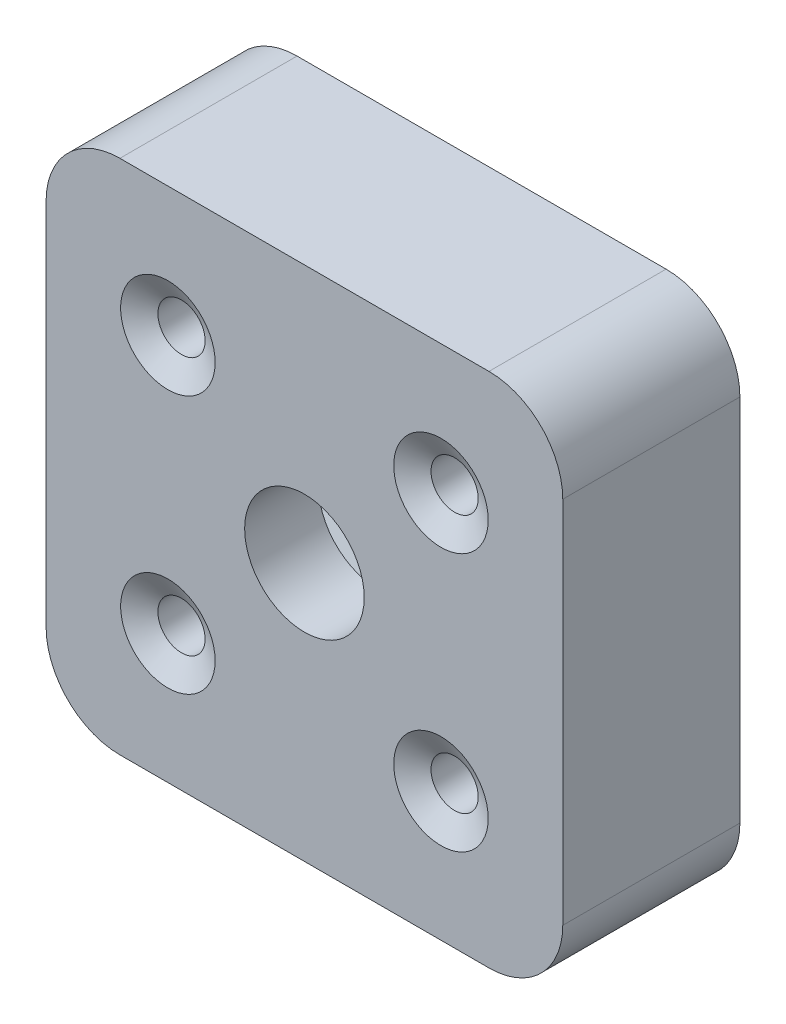
ISO-10303-21;
HEADER;
FILE_DESCRIPTION(('STEP AP214'),'2;1');
FILE_NAME('part.step','',(''),(''),'','','');
FILE_SCHEMA(('AUTOMOTIVE_DESIGN { 1 0 10303 214 1 1 1 1 }'));
ENDSEC;
DATA;
#1=APPLICATION_CONTEXT('core data for automotive mechanical design processes');
#2=APPLICATION_PROTOCOL_DEFINITION('international standard','automotive_design',2000,#1);
#3=PRODUCT_CONTEXT('',#1,'mechanical');
#4=PRODUCT('Part','Part','',(#3));
#5=PRODUCT_RELATED_PRODUCT_CATEGORY('part','',(#4));
#6=PRODUCT_DEFINITION_FORMATION('','',#4);
#7=PRODUCT_DEFINITION_CONTEXT('part definition',#1,'design');
#8=PRODUCT_DEFINITION('design','',#6,#7);
#9=PRODUCT_DEFINITION_SHAPE('','',#8);
#10=(LENGTH_UNIT() NAMED_UNIT(*) SI_UNIT(.MILLI.,.METRE.));
#11=(NAMED_UNIT(*) PLANE_ANGLE_UNIT() SI_UNIT($,.RADIAN.));
#12=(NAMED_UNIT(*) SI_UNIT($,.STERADIAN.) SOLID_ANGLE_UNIT());
#13=UNCERTAINTY_MEASURE_WITH_UNIT(LENGTH_MEASURE(1.E-05),#10,'distance_accuracy_value','');
#14=(GEOMETRIC_REPRESENTATION_CONTEXT(3) GLOBAL_UNCERTAINTY_ASSIGNED_CONTEXT((#13)) GLOBAL_UNIT_ASSIGNED_CONTEXT((#10,
#11,#12)) REPRESENTATION_CONTEXT('',''));
#15=CARTESIAN_POINT('',(0.,0.,0.));
#16=DIRECTION('',(0.,0.,1.));
#17=DIRECTION('',(1.,0.,0.));
#18=AXIS2_PLACEMENT_3D('',#15,#16,#17);
#19=CARTESIAN_POINT('',(0.,0.,12.));
#20=DIRECTION('',(0.,0.,-1.));
#21=DIRECTION('',(-1.,0.,0.));
#22=AXIS2_PLACEMENT_3D('',#19,#20,#21);
#23=CYLINDRICAL_SURFACE('',#22,4.05);
#24=CARTESIAN_POINT('',(0.,0.,12.));
#25=DIRECTION('',(0.,0.,1.));
#26=DIRECTION('',(1.,0.,0.));
#27=AXIS2_PLACEMENT_3D('',#24,#25,#26);
#28=CIRCLE('',#27,4.05);
#29=CARTESIAN_POINT('',(4.05,0.,12.));
#30=VERTEX_POINT('',#29);
#31=EDGE_CURVE('E233',#30,#30,#28,.T.);
#32=ORIENTED_EDGE('',*,*,#31,.T.);
#33=EDGE_LOOP('',(#32));
#34=FACE_BOUND('',#33,.T.);
#35=CARTESIAN_POINT('',(0.,0.,7.));
#36=DIRECTION('',(0.,0.,-1.));
#37=DIRECTION('',(-1.,0.,0.));
#38=AXIS2_PLACEMENT_3D('',#35,#36,#37);
#39=CIRCLE('',#38,4.05);
#40=CARTESIAN_POINT('',(-4.05,0.,7.));
#41=VERTEX_POINT('',#40);
#42=EDGE_CURVE('E43',#41,#41,#39,.T.);
#43=ORIENTED_EDGE('',*,*,#42,.T.);
#44=EDGE_LOOP('',(#43));
#45=FACE_BOUND('',#44,.T.);
#46=ADVANCED_FACE('F39',(#34,#45),#23,.F.);
#47=CARTESIAN_POINT('',(0.,-17.5,12.));
#48=DIRECTION('',(0.,1.,0.));
#49=DIRECTION('',(0.,0.,1.));
#50=AXIS2_PLACEMENT_3D('',#47,#48,#49);
#51=PLANE('',#50);
#52=DIRECTION('',(1.,0.,0.));
#53=VECTOR('',#52,1.);
#54=CARTESIAN_POINT('',(0.,-17.5,0.));
#55=LINE('',#54,#53);
#56=CARTESIAN_POINT('',(-12.5,-17.5,0.));
#57=VERTEX_POINT('',#56);
#58=CARTESIAN_POINT('',(12.5,-17.5,0.));
#59=VERTEX_POINT('',#58);
#60=EDGE_CURVE('E248',#57,#59,#55,.T.);
#61=ORIENTED_EDGE('',*,*,#60,.T.);
#62=DIRECTION('',(0.,0.,-1.));
#63=VECTOR('',#62,1.);
#64=CARTESIAN_POINT('',(12.5,-17.5,12.));
#65=LINE('',#64,#63);
#66=CARTESIAN_POINT('',(12.5,-17.5,12.));
#67=VERTEX_POINT('',#66);
#68=EDGE_CURVE('E274',#59,#67,#65,.F.);
#69=ORIENTED_EDGE('',*,*,#68,.T.);
#70=DIRECTION('',(1.,0.,0.));
#71=VECTOR('',#70,1.);
#72=CARTESIAN_POINT('',(0.,-17.5,12.));
#73=LINE('',#72,#71);
#74=CARTESIAN_POINT('',(-12.5,-17.5,12.));
#75=VERTEX_POINT('',#74);
#76=EDGE_CURVE('E221',#75,#67,#73,.T.);
#77=ORIENTED_EDGE('',*,*,#76,.F.);
#78=DIRECTION('',(0.,0.,-1.));
#79=VECTOR('',#78,1.);
#80=CARTESIAN_POINT('',(-12.5,-17.5,0.));
#81=LINE('',#80,#79);
#82=EDGE_CURVE('E271',#75,#57,#81,.T.);
#83=ORIENTED_EDGE('',*,*,#82,.T.);
#84=EDGE_LOOP('',(#61,#69,#77,#83));
#85=FACE_BOUND('',#84,.T.);
#86=ADVANCED_FACE('F315',(#85),#51,.F.);
#87=CARTESIAN_POINT('',(17.5,0.,12.));
#88=DIRECTION('',(-1.,0.,0.));
#89=DIRECTION('',(0.,0.,1.));
#90=AXIS2_PLACEMENT_3D('',#87,#88,#89);
#91=PLANE('',#90);
#92=DIRECTION('',(0.,1.,0.));
#93=VECTOR('',#92,1.);
#94=CARTESIAN_POINT('',(17.5,0.,12.));
#95=LINE('',#94,#93);
#96=CARTESIAN_POINT('',(17.5,-12.5,12.));
#97=VERTEX_POINT('',#96);
#98=CARTESIAN_POINT('',(17.5,12.5,12.));
#99=VERTEX_POINT('',#98);
#100=EDGE_CURVE('E224',#97,#99,#95,.T.);
#101=ORIENTED_EDGE('',*,*,#100,.F.);
#102=DIRECTION('',(0.,0.,-1.));
#103=VECTOR('',#102,1.);
#104=CARTESIAN_POINT('',(17.5,-12.5,12.));
#105=LINE('',#104,#103);
#106=CARTESIAN_POINT('',(17.5,-12.5,0.));
#107=VERTEX_POINT('',#106);
#108=EDGE_CURVE('E260',#97,#107,#105,.T.);
#109=ORIENTED_EDGE('',*,*,#108,.T.);
#110=DIRECTION('',(0.,1.,0.));
#111=VECTOR('',#110,1.);
#112=CARTESIAN_POINT('',(17.5,0.,0.));
#113=LINE('',#112,#111);
#114=CARTESIAN_POINT('',(17.5,12.5,0.));
#115=VERTEX_POINT('',#114);
#116=EDGE_CURVE('E251',#107,#115,#113,.T.);
#117=ORIENTED_EDGE('',*,*,#116,.T.);
#118=DIRECTION('',(0.,0.,-1.));
#119=VECTOR('',#118,1.);
#120=CARTESIAN_POINT('',(17.5,12.5,12.));
#121=LINE('',#120,#119);
#122=EDGE_CURVE('E236',#115,#99,#121,.F.);
#123=ORIENTED_EDGE('',*,*,#122,.T.);
#124=EDGE_LOOP('',(#101,#109,#117,#123));
#125=FACE_BOUND('',#124,.T.);
#126=ADVANCED_FACE('F323',(#125),#91,.F.);
#127=CARTESIAN_POINT('',(0.,17.5,12.));
#128=DIRECTION('',(0.,1.,0.));
#129=DIRECTION('',(0.,0.,1.));
#130=AXIS2_PLACEMENT_3D('',#127,#128,#129);
#131=PLANE('',#130);
#132=DIRECTION('',(1.,0.,0.));
#133=VECTOR('',#132,1.);
#134=CARTESIAN_POINT('',(0.,17.5,0.));
#135=LINE('',#134,#133);
#136=CARTESIAN_POINT('',(-12.5,17.5,0.));
#137=VERTEX_POINT('',#136);
#138=CARTESIAN_POINT('',(12.5,17.5,0.));
#139=VERTEX_POINT('',#138);
#140=EDGE_CURVE('E254',#137,#139,#135,.T.);
#141=ORIENTED_EDGE('',*,*,#140,.F.);
#142=DIRECTION('',(0.,0.,-1.));
#143=VECTOR('',#142,1.);
#144=CARTESIAN_POINT('',(-12.5,17.5,12.));
#145=LINE('',#144,#143);
#146=CARTESIAN_POINT('',(-12.5,17.5,12.));
#147=VERTEX_POINT('',#146);
#148=EDGE_CURVE('E11',#137,#147,#145,.F.);
#149=ORIENTED_EDGE('',*,*,#148,.T.);
#150=DIRECTION('',(1.,0.,0.));
#151=VECTOR('',#150,1.);
#152=CARTESIAN_POINT('',(0.,17.5,12.));
#153=LINE('',#152,#151);
#154=CARTESIAN_POINT('',(12.5,17.5,12.));
#155=VERTEX_POINT('',#154);
#156=EDGE_CURVE('E228',#147,#155,#153,.T.);
#157=ORIENTED_EDGE('',*,*,#156,.T.);
#158=DIRECTION('',(0.,0.,-1.));
#159=VECTOR('',#158,1.);
#160=CARTESIAN_POINT('',(12.5,17.5,0.));
#161=LINE('',#160,#159);
#162=EDGE_CURVE('E48',#155,#139,#161,.T.);
#163=ORIENTED_EDGE('',*,*,#162,.T.);
#164=EDGE_LOOP('',(#141,#149,#157,#163));
#165=FACE_BOUND('',#164,.T.);
#166=ADVANCED_FACE('F292',(#165),#131,.T.);
#167=CARTESIAN_POINT('',(-17.5,0.,12.));
#168=DIRECTION('',(-1.,0.,0.));
#169=DIRECTION('',(0.,0.,1.));
#170=AXIS2_PLACEMENT_3D('',#167,#168,#169);
#171=PLANE('',#170);
#172=DIRECTION('',(0.,1.,0.));
#173=VECTOR('',#172,1.);
#174=CARTESIAN_POINT('',(-17.5,0.,0.));
#175=LINE('',#174,#173);
#176=CARTESIAN_POINT('',(-17.5,-12.5,0.));
#177=VERTEX_POINT('',#176);
#178=CARTESIAN_POINT('',(-17.5,12.5,0.));
#179=VERTEX_POINT('',#178);
#180=EDGE_CURVE('E225',#177,#179,#175,.T.);
#181=ORIENTED_EDGE('',*,*,#180,.F.);
#182=DIRECTION('',(0.,0.,-1.));
#183=VECTOR('',#182,1.);
#184=CARTESIAN_POINT('',(-17.5,-12.5,12.));
#185=LINE('',#184,#183);
#186=CARTESIAN_POINT('',(-17.5,-12.5,12.));
#187=VERTEX_POINT('',#186);
#188=EDGE_CURVE('E286',#177,#187,#185,.F.);
#189=ORIENTED_EDGE('',*,*,#188,.T.);
#190=DIRECTION('',(0.,1.,0.));
#191=VECTOR('',#190,1.);
#192=CARTESIAN_POINT('',(-17.5,0.,12.));
#193=LINE('',#192,#191);
#194=CARTESIAN_POINT('',(-17.5,12.5,12.));
#195=VERTEX_POINT('',#194);
#196=EDGE_CURVE('E231',#187,#195,#193,.T.);
#197=ORIENTED_EDGE('',*,*,#196,.T.);
#198=DIRECTION('',(0.,0.,-1.));
#199=VECTOR('',#198,1.);
#200=CARTESIAN_POINT('',(-17.5,12.5,12.));
#201=LINE('',#200,#199);
#202=EDGE_CURVE('E283',#195,#179,#201,.T.);
#203=ORIENTED_EDGE('',*,*,#202,.T.);
#204=EDGE_LOOP('',(#181,#189,#197,#203));
#205=FACE_BOUND('',#204,.T.);
#206=ADVANCED_FACE('F304',(#205),#171,.T.);
#207=CARTESIAN_POINT('',(-9.25,-8.75,12.));
#208=DIRECTION('',(0.,0.,-1.));
#209=DIRECTION('',(-1.,0.,0.));
#210=AXIS2_PLACEMENT_3D('',#207,#208,#209);
#211=CYLINDRICAL_SURFACE('',#210,1.6);
#212=CARTESIAN_POINT('',(-9.25,-8.75,11.0762395692966));
#213=DIRECTION('',(0.,0.,1.));
#214=DIRECTION('',(1.,0.,0.));
#215=AXIS2_PLACEMENT_3D('',#212,#213,#214);
#216=CIRCLE('',#215,1.6);
#217=CARTESIAN_POINT('',(-7.65,-8.75,11.0762395692966));
#218=VERTEX_POINT('',#217);
#219=EDGE_CURVE('E214',#218,#218,#216,.F.);
#220=ORIENTED_EDGE('',*,*,#219,.F.);
#221=EDGE_LOOP('',(#220));
#222=FACE_BOUND('',#221,.T.);
#223=CARTESIAN_POINT('',(-9.25,-8.75,0.));
#224=DIRECTION('',(0.,0.,1.));
#225=DIRECTION('',(1.,0.,0.));
#226=AXIS2_PLACEMENT_3D('',#223,#224,#225);
#227=CIRCLE('',#226,1.6);
#228=CARTESIAN_POINT('',(-7.65,-8.75,0.));
#229=VERTEX_POINT('',#228);
#230=EDGE_CURVE('E245',#229,#229,#227,.T.);
#231=ORIENTED_EDGE('',*,*,#230,.F.);
#232=EDGE_LOOP('',(#231));
#233=FACE_BOUND('',#232,.T.);
#234=ADVANCED_FACE('F347',(#222,#233),#211,.F.);
#235=CARTESIAN_POINT('',(9.25,8.75,12.));
#236=DIRECTION('',(0.,0.,-1.));
#237=DIRECTION('',(-1.,0.,0.));
#238=AXIS2_PLACEMENT_3D('',#235,#236,#237);
#239=CYLINDRICAL_SURFACE('',#238,1.6);
#240=CARTESIAN_POINT('',(9.25,8.75,11.0762395692966));
#241=DIRECTION('',(0.,0.,1.));
#242=DIRECTION('',(1.,0.,0.));
#243=AXIS2_PLACEMENT_3D('',#240,#241,#242);
#244=CIRCLE('',#243,1.6);
#245=CARTESIAN_POINT('',(10.85,8.75,11.0762395692966));
#246=VERTEX_POINT('',#245);
#247=EDGE_CURVE('E217',#246,#246,#244,.F.);
#248=ORIENTED_EDGE('',*,*,#247,.F.);
#249=EDGE_LOOP('',(#248));
#250=FACE_BOUND('',#249,.T.);
#251=CARTESIAN_POINT('',(9.25,8.75,0.));
#252=DIRECTION('',(0.,0.,1.));
#253=DIRECTION('',(1.,0.,0.));
#254=AXIS2_PLACEMENT_3D('',#251,#252,#253);
#255=CIRCLE('',#254,1.6);
#256=CARTESIAN_POINT('',(10.85,8.75,0.));
#257=VERTEX_POINT('',#256);
#258=EDGE_CURVE('E242',#257,#257,#255,.T.);
#259=ORIENTED_EDGE('',*,*,#258,.F.);
#260=EDGE_LOOP('',(#259));
#261=FACE_BOUND('',#260,.T.);
#262=ADVANCED_FACE('F354',(#250,#261),#239,.F.);
#263=CARTESIAN_POINT('',(-9.25,8.75,12.));
#264=DIRECTION('',(0.,0.,-1.));
#265=DIRECTION('',(-1.,0.,0.));
#266=AXIS2_PLACEMENT_3D('',#263,#264,#265);
#267=CYLINDRICAL_SURFACE('',#266,1.6);
#268=CARTESIAN_POINT('',(-9.25,8.75,11.0762395692966));
#269=DIRECTION('',(0.,0.,1.));
#270=DIRECTION('',(1.,0.,0.));
#271=AXIS2_PLACEMENT_3D('',#268,#269,#270);
#272=CIRCLE('',#271,1.6);
#273=CARTESIAN_POINT('',(-7.65,8.75,11.0762395692966));
#274=VERTEX_POINT('',#273);
#275=EDGE_CURVE('E208',#274,#274,#272,.F.);
#276=ORIENTED_EDGE('',*,*,#275,.F.);
#277=EDGE_LOOP('',(#276));
#278=FACE_BOUND('',#277,.T.);
#279=CARTESIAN_POINT('',(-9.25,8.75,0.));
#280=DIRECTION('',(0.,0.,1.));
#281=DIRECTION('',(1.,0.,0.));
#282=AXIS2_PLACEMENT_3D('',#279,#280,#281);
#283=CIRCLE('',#282,1.6);
#284=CARTESIAN_POINT('',(-7.65,8.75,0.));
#285=VERTEX_POINT('',#284);
#286=EDGE_CURVE('E239',#285,#285,#283,.T.);
#287=ORIENTED_EDGE('',*,*,#286,.F.);
#288=EDGE_LOOP('',(#287));
#289=FACE_BOUND('',#288,.T.);
#290=ADVANCED_FACE('F358',(#278,#289),#267,.F.);
#291=CARTESIAN_POINT('',(9.25,-8.75,12.));
#292=DIRECTION('',(0.,0.,-1.));
#293=DIRECTION('',(-1.,0.,0.));
#294=AXIS2_PLACEMENT_3D('',#291,#292,#293);
#295=CYLINDRICAL_SURFACE('',#294,1.6);
#296=CARTESIAN_POINT('',(9.25,-8.75,11.0762395692966));
#297=DIRECTION('',(0.,0.,1.));
#298=DIRECTION('',(1.,0.,0.));
#299=AXIS2_PLACEMENT_3D('',#296,#297,#298);
#300=CIRCLE('',#299,1.6);
#301=CARTESIAN_POINT('',(10.85,-8.75,11.0762395692966));
#302=VERTEX_POINT('',#301);
#303=EDGE_CURVE('E211',#302,#302,#300,.F.);
#304=ORIENTED_EDGE('',*,*,#303,.F.);
#305=EDGE_LOOP('',(#304));
#306=FACE_BOUND('',#305,.T.);
#307=CARTESIAN_POINT('',(9.25,-8.75,0.));
#308=DIRECTION('',(0.,0.,1.));
#309=DIRECTION('',(1.,0.,0.));
#310=AXIS2_PLACEMENT_3D('',#307,#308,#309);
#311=CIRCLE('',#310,1.6);
#312=CARTESIAN_POINT('',(10.85,-8.75,0.));
#313=VERTEX_POINT('',#312);
#314=EDGE_CURVE('E220',#313,#313,#311,.T.);
#315=ORIENTED_EDGE('',*,*,#314,.F.);
#316=EDGE_LOOP('',(#315));
#317=FACE_BOUND('',#316,.T.);
#318=ADVANCED_FACE('F362',(#306,#317),#295,.F.);
#319=CARTESIAN_POINT('',(0.,0.,12.));
#320=DIRECTION('',(0.,0.,1.));
#321=DIRECTION('',(1.,0.,0.));
#322=AXIS2_PLACEMENT_3D('',#319,#320,#321);
#323=PLANE('',#322);
#324=CARTESIAN_POINT('',(9.25,8.75,12.));
#325=DIRECTION('',(0.,0.,1.));
#326=DIRECTION('',(1.,0.,0.));
#327=AXIS2_PLACEMENT_3D('',#324,#325,#326);
#328=CIRCLE('',#327,3.2);
#329=CARTESIAN_POINT('',(12.45,8.75,12.));
#330=VERTEX_POINT('',#329);
#331=EDGE_CURVE('E200',#330,#330,#328,.T.);
#332=ORIENTED_EDGE('',*,*,#331,.F.);
#333=EDGE_LOOP('',(#332));
#334=FACE_BOUND('',#333,.T.);
#335=CARTESIAN_POINT('',(-9.25,-8.75,12.));
#336=DIRECTION('',(0.,0.,1.));
#337=DIRECTION('',(1.,0.,0.));
#338=AXIS2_PLACEMENT_3D('',#335,#336,#337);
#339=CIRCLE('',#338,3.2);
#340=CARTESIAN_POINT('',(-6.05,-8.75,12.));
#341=VERTEX_POINT('',#340);
#342=EDGE_CURVE('E199',#341,#341,#339,.T.);
#343=ORIENTED_EDGE('',*,*,#342,.F.);
#344=EDGE_LOOP('',(#343));
#345=FACE_BOUND('',#344,.T.);
#346=CARTESIAN_POINT('',(9.25,-8.75,12.));
#347=DIRECTION('',(0.,0.,1.));
#348=DIRECTION('',(1.,0.,0.));
#349=AXIS2_PLACEMENT_3D('',#346,#347,#348);
#350=CIRCLE('',#349,3.2);
#351=CARTESIAN_POINT('',(12.45,-8.75,12.));
#352=VERTEX_POINT('',#351);
#353=EDGE_CURVE('E196',#352,#352,#350,.T.);
#354=ORIENTED_EDGE('',*,*,#353,.F.);
#355=EDGE_LOOP('',(#354));
#356=FACE_BOUND('',#355,.T.);
#357=CARTESIAN_POINT('',(-9.25,8.75,12.));
#358=DIRECTION('',(0.,0.,1.));
#359=DIRECTION('',(1.,0.,0.));
#360=AXIS2_PLACEMENT_3D('',#357,#358,#359);
#361=CIRCLE('',#360,3.2);
#362=CARTESIAN_POINT('',(-6.05,8.75,12.));
#363=VERTEX_POINT('',#362);
#364=EDGE_CURVE('E203',#363,#363,#361,.T.);
#365=ORIENTED_EDGE('',*,*,#364,.F.);
#366=EDGE_LOOP('',(#365));
#367=FACE_BOUND('',#366,.T.);
#368=ORIENTED_EDGE('',*,*,#76,.T.);
#369=CARTESIAN_POINT('',(12.5,-12.5,12.));
#370=DIRECTION('',(0.,0.,1.));
#371=DIRECTION('',(1.,0.,0.));
#372=AXIS2_PLACEMENT_3D('',#369,#370,#371);
#373=CIRCLE('',#372,5.);
#374=EDGE_CURVE('E281',#67,#97,#373,.T.);
#375=ORIENTED_EDGE('',*,*,#374,.T.);
#376=ORIENTED_EDGE('',*,*,#100,.T.);
#377=CARTESIAN_POINT('',(12.5,12.5,12.));
#378=DIRECTION('',(0.,0.,1.));
#379=DIRECTION('',(1.,0.,0.));
#380=AXIS2_PLACEMENT_3D('',#377,#378,#379);
#381=CIRCLE('',#380,5.);
#382=EDGE_CURVE('E276',#99,#155,#381,.T.);
#383=ORIENTED_EDGE('',*,*,#382,.T.);
#384=ORIENTED_EDGE('',*,*,#156,.F.);
#385=CARTESIAN_POINT('',(-12.5,12.5,12.));
#386=DIRECTION('',(0.,0.,1.));
#387=DIRECTION('',(1.,0.,0.));
#388=AXIS2_PLACEMENT_3D('',#385,#386,#387);
#389=CIRCLE('',#388,5.);
#390=EDGE_CURVE('E63',#147,#195,#389,.T.);
#391=ORIENTED_EDGE('',*,*,#390,.T.);
#392=ORIENTED_EDGE('',*,*,#196,.F.);
#393=CARTESIAN_POINT('',(-12.5,-12.5,12.));
#394=DIRECTION('',(0.,0.,1.));
#395=DIRECTION('',(1.,0.,0.));
#396=AXIS2_PLACEMENT_3D('',#393,#394,#395);
#397=CIRCLE('',#396,5.);
#398=EDGE_CURVE('E279',#187,#75,#397,.T.);
#399=ORIENTED_EDGE('',*,*,#398,.T.);
#400=EDGE_LOOP('',(#368,#375,#376,#383,#384,#391,#392,#399));
#401=FACE_BOUND('',#400,.T.);
#402=ORIENTED_EDGE('',*,*,#31,.F.);
#403=EDGE_LOOP('',(#402));
#404=FACE_BOUND('',#403,.T.);
#405=ADVANCED_FACE('F307',(#334,#345,#356,#367,#401,#404),#323,.T.);
#406=CARTESIAN_POINT('',(0.,0.,0.));
#407=DIRECTION('',(0.,0.,1.));
#408=DIRECTION('',(1.,0.,0.));
#409=AXIS2_PLACEMENT_3D('',#406,#407,#408);
#410=PLANE('',#409);
#411=DIRECTION('',(0.866025403784439,0.499999999999999,0.));
#412=VECTOR('',#411,1.);
#413=CARTESIAN_POINT('',(-6.53849179857251,3.77500000000001,0.));
#414=LINE('',#413,#412);
#415=CARTESIAN_POINT('',(-6.53849179857251,3.77500000000001,0.));
#416=VERTEX_POINT('',#415);
#417=CARTESIAN_POINT('',(0.,7.55,0.));
#418=VERTEX_POINT('',#417);
#419=EDGE_CURVE('E177',#416,#418,#414,.T.);
#420=ORIENTED_EDGE('',*,*,#419,.F.);
#421=DIRECTION('',(0.,1.,0.));
#422=VECTOR('',#421,1.);
#423=CARTESIAN_POINT('',(-6.53849179857251,-3.77499999999999,0.));
#424=LINE('',#423,#422);
#425=CARTESIAN_POINT('',(-6.53849179857251,-3.77499999999999,0.));
#426=VERTEX_POINT('',#425);
#427=EDGE_CURVE('E55',#426,#416,#424,.T.);
#428=ORIENTED_EDGE('',*,*,#427,.F.);
#429=DIRECTION('',(-0.866025403784438,0.500000000000001,0.));
#430=VECTOR('',#429,1.);
#431=CARTESIAN_POINT('',(0.,-7.55,0.));
#432=LINE('',#431,#430);
#433=CARTESIAN_POINT('',(0.,-7.55,0.));
#434=VERTEX_POINT('',#433);
#435=EDGE_CURVE('E163',#434,#426,#432,.T.);
#436=ORIENTED_EDGE('',*,*,#435,.F.);
#437=DIRECTION('',(-0.866025403784439,-0.499999999999999,0.));
#438=VECTOR('',#437,1.);
#439=CARTESIAN_POINT('',(6.53849179857251,-3.77500000000001,0.));
#440=LINE('',#439,#438);
#441=CARTESIAN_POINT('',(6.53849179857251,-3.77500000000001,0.));
#442=VERTEX_POINT('',#441);
#443=EDGE_CURVE('E166',#442,#434,#440,.T.);
#444=ORIENTED_EDGE('',*,*,#443,.F.);
#445=DIRECTION('',(0.,-1.,0.));
#446=VECTOR('',#445,1.);
#447=CARTESIAN_POINT('',(6.53849179857252,3.77499999999999,0.));
#448=LINE('',#447,#446);
#449=CARTESIAN_POINT('',(6.53849179857252,3.77499999999999,0.));
#450=VERTEX_POINT('',#449);
#451=EDGE_CURVE('E182',#450,#442,#448,.T.);
#452=ORIENTED_EDGE('',*,*,#451,.F.);
#453=DIRECTION('',(0.866025403784438,-0.500000000000001,0.));
#454=VECTOR('',#453,1.);
#455=CARTESIAN_POINT('',(0.,7.55,0.));
#456=LINE('',#455,#454);
#457=EDGE_CURVE('E179',#418,#450,#456,.T.);
#458=ORIENTED_EDGE('',*,*,#457,.F.);
#459=EDGE_LOOP('',(#420,#428,#436,#444,#452,#458));
#460=FACE_BOUND('',#459,.T.);
#461=ORIENTED_EDGE('',*,*,#314,.T.);
#462=EDGE_LOOP('',(#461));
#463=FACE_BOUND('',#462,.T.);
#464=ORIENTED_EDGE('',*,*,#286,.T.);
#465=EDGE_LOOP('',(#464));
#466=FACE_BOUND('',#465,.T.);
#467=ORIENTED_EDGE('',*,*,#258,.T.);
#468=EDGE_LOOP('',(#467));
#469=FACE_BOUND('',#468,.T.);
#470=ORIENTED_EDGE('',*,*,#230,.T.);
#471=EDGE_LOOP('',(#470));
#472=FACE_BOUND('',#471,.T.);
#473=ORIENTED_EDGE('',*,*,#116,.F.);
#474=CARTESIAN_POINT('',(12.5,-12.5,0.));
#475=DIRECTION('',(0.,0.,1.));
#476=DIRECTION('',(1.,0.,0.));
#477=AXIS2_PLACEMENT_3D('',#474,#475,#476);
#478=CIRCLE('',#477,5.);
#479=EDGE_CURVE('E269',#107,#59,#478,.F.);
#480=ORIENTED_EDGE('',*,*,#479,.T.);
#481=ORIENTED_EDGE('',*,*,#60,.F.);
#482=CARTESIAN_POINT('',(-12.5,-12.5,0.));
#483=DIRECTION('',(0.,0.,1.));
#484=DIRECTION('',(1.,0.,0.));
#485=AXIS2_PLACEMENT_3D('',#482,#483,#484);
#486=CIRCLE('',#485,5.);
#487=EDGE_CURVE('E267',#57,#177,#486,.F.);
#488=ORIENTED_EDGE('',*,*,#487,.T.);
#489=ORIENTED_EDGE('',*,*,#180,.T.);
#490=CARTESIAN_POINT('',(-12.5,12.5,0.));
#491=DIRECTION('',(0.,0.,1.));
#492=DIRECTION('',(1.,0.,0.));
#493=AXIS2_PLACEMENT_3D('',#490,#491,#492);
#494=CIRCLE('',#493,5.);
#495=EDGE_CURVE('E265',#179,#137,#494,.F.);
#496=ORIENTED_EDGE('',*,*,#495,.T.);
#497=ORIENTED_EDGE('',*,*,#140,.T.);
#498=CARTESIAN_POINT('',(12.5,12.5,0.));
#499=DIRECTION('',(0.,0.,1.));
#500=DIRECTION('',(1.,0.,0.));
#501=AXIS2_PLACEMENT_3D('',#498,#499,#500);
#502=CIRCLE('',#501,5.);
#503=EDGE_CURVE('E263',#139,#115,#502,.F.);
#504=ORIENTED_EDGE('',*,*,#503,.T.);
#505=EDGE_LOOP('',(#473,#480,#481,#488,#489,#496,#497,#504));
#506=FACE_BOUND('',#505,.T.);
#507=ADVANCED_FACE('F298',(#460,#463,#466,#469,#472,#506),#410,.F.);
#508=CARTESIAN_POINT('',(12.5,-12.5,12.));
#509=DIRECTION('',(0.,0.,-1.));
#510=DIRECTION('',(-1.,0.,0.));
#511=AXIS2_PLACEMENT_3D('',#508,#509,#510);
#512=CYLINDRICAL_SURFACE('',#511,5.);
#513=ORIENTED_EDGE('',*,*,#374,.F.);
#514=ORIENTED_EDGE('',*,*,#68,.F.);
#515=ORIENTED_EDGE('',*,*,#479,.F.);
#516=ORIENTED_EDGE('',*,*,#108,.F.);
#517=EDGE_LOOP('',(#513,#514,#515,#516));
#518=FACE_BOUND('',#517,.T.);
#519=ADVANCED_FACE('F320',(#518),#512,.T.);
#520=CARTESIAN_POINT('',(-12.5,-12.5,12.));
#521=DIRECTION('',(0.,0.,1.));
#522=DIRECTION('',(1.,0.,0.));
#523=AXIS2_PLACEMENT_3D('',#520,#521,#522);
#524=CYLINDRICAL_SURFACE('',#523,5.);
#525=ORIENTED_EDGE('',*,*,#398,.F.);
#526=ORIENTED_EDGE('',*,*,#188,.F.);
#527=ORIENTED_EDGE('',*,*,#487,.F.);
#528=ORIENTED_EDGE('',*,*,#82,.F.);
#529=EDGE_LOOP('',(#525,#526,#527,#528));
#530=FACE_BOUND('',#529,.T.);
#531=ADVANCED_FACE('F312',(#530),#524,.T.);
#532=CARTESIAN_POINT('',(-12.5,12.5,12.));
#533=DIRECTION('',(0.,0.,-1.));
#534=DIRECTION('',(-1.,0.,0.));
#535=AXIS2_PLACEMENT_3D('',#532,#533,#534);
#536=CYLINDRICAL_SURFACE('',#535,5.);
#537=ORIENTED_EDGE('',*,*,#390,.F.);
#538=ORIENTED_EDGE('',*,*,#148,.F.);
#539=ORIENTED_EDGE('',*,*,#495,.F.);
#540=ORIENTED_EDGE('',*,*,#202,.F.);
#541=EDGE_LOOP('',(#537,#538,#539,#540));
#542=FACE_BOUND('',#541,.T.);
#543=ADVANCED_FACE('F302',(#542),#536,.T.);
#544=CARTESIAN_POINT('',(12.5,12.5,12.));
#545=DIRECTION('',(0.,0.,1.));
#546=DIRECTION('',(1.,0.,0.));
#547=AXIS2_PLACEMENT_3D('',#544,#545,#546);
#548=CYLINDRICAL_SURFACE('',#547,5.);
#549=ORIENTED_EDGE('',*,*,#382,.F.);
#550=ORIENTED_EDGE('',*,*,#122,.F.);
#551=ORIENTED_EDGE('',*,*,#503,.F.);
#552=ORIENTED_EDGE('',*,*,#162,.F.);
#553=EDGE_LOOP('',(#549,#550,#551,#552));
#554=FACE_BOUND('',#553,.T.);
#555=ADVANCED_FACE('F41',(#554),#548,.T.);
#556=CARTESIAN_POINT('',(-9.25,8.75,12.));
#557=DIRECTION('',(0.,0.,1.));
#558=DIRECTION('',(1.,0.,0.));
#559=AXIS2_PLACEMENT_3D('',#556,#557,#558);
#560=CONICAL_SURFACE('',#559,3.2,1.0471975511966);
#561=ORIENTED_EDGE('',*,*,#275,.T.);
#562=EDGE_LOOP('',(#561));
#563=FACE_BOUND('',#562,.T.);
#564=ORIENTED_EDGE('',*,*,#364,.T.);
#565=EDGE_LOOP('',(#564));
#566=FACE_BOUND('',#565,.T.);
#567=ADVANCED_FACE('F326',(#563,#566),#560,.F.);
#568=CARTESIAN_POINT('',(9.25,-8.75,12.));
#569=DIRECTION('',(0.,0.,1.));
#570=DIRECTION('',(1.,0.,0.));
#571=AXIS2_PLACEMENT_3D('',#568,#569,#570);
#572=CONICAL_SURFACE('',#571,3.2,1.0471975511966);
#573=ORIENTED_EDGE('',*,*,#303,.T.);
#574=EDGE_LOOP('',(#573));
#575=FACE_BOUND('',#574,.T.);
#576=ORIENTED_EDGE('',*,*,#353,.T.);
#577=EDGE_LOOP('',(#576));
#578=FACE_BOUND('',#577,.T.);
#579=ADVANCED_FACE('F331',(#575,#578),#572,.F.);
#580=CARTESIAN_POINT('',(-9.25,-8.75,12.));
#581=DIRECTION('',(0.,0.,1.));
#582=DIRECTION('',(1.,0.,0.));
#583=AXIS2_PLACEMENT_3D('',#580,#581,#582);
#584=CONICAL_SURFACE('',#583,3.2,1.0471975511966);
#585=ORIENTED_EDGE('',*,*,#219,.T.);
#586=EDGE_LOOP('',(#585));
#587=FACE_BOUND('',#586,.T.);
#588=ORIENTED_EDGE('',*,*,#342,.T.);
#589=EDGE_LOOP('',(#588));
#590=FACE_BOUND('',#589,.T.);
#591=ADVANCED_FACE('F433',(#587,#590),#584,.F.);
#592=CARTESIAN_POINT('',(9.25,8.75,12.));
#593=DIRECTION('',(0.,0.,1.));
#594=DIRECTION('',(1.,0.,0.));
#595=AXIS2_PLACEMENT_3D('',#592,#593,#594);
#596=CONICAL_SURFACE('',#595,3.2,1.0471975511966);
#597=ORIENTED_EDGE('',*,*,#247,.T.);
#598=EDGE_LOOP('',(#597));
#599=FACE_BOUND('',#598,.T.);
#600=ORIENTED_EDGE('',*,*,#331,.T.);
#601=EDGE_LOOP('',(#600));
#602=FACE_BOUND('',#601,.T.);
#603=ADVANCED_FACE('F443',(#599,#602),#596,.F.);
#604=CARTESIAN_POINT('',(-6.53849179857251,-3.77499999999999,7.));
#605=DIRECTION('',(-1.,0.,0.));
#606=DIRECTION('',(0.,-1.,0.));
#607=AXIS2_PLACEMENT_3D('',#604,#605,#606);
#608=PLANE('',#607);
#609=ORIENTED_EDGE('',*,*,#427,.T.);
#610=DIRECTION('',(0.,0.,-1.));
#611=VECTOR('',#610,1.);
#612=CARTESIAN_POINT('',(-6.53849179857251,3.77500000000001,7.));
#613=LINE('',#612,#611);
#614=CARTESIAN_POINT('',(-6.53849179857251,3.77500000000001,7.));
#615=VERTEX_POINT('',#614);
#616=EDGE_CURVE('E140',#615,#416,#613,.T.);
#617=ORIENTED_EDGE('',*,*,#616,.F.);
#618=DIRECTION('',(0.,1.,0.));
#619=VECTOR('',#618,1.);
#620=CARTESIAN_POINT('',(-6.53849179857251,-3.77499999999999,7.));
#621=LINE('',#620,#619);
#622=CARTESIAN_POINT('',(-6.53849179857251,-3.77499999999999,7.));
#623=VERTEX_POINT('',#622);
#624=EDGE_CURVE('E144',#623,#615,#621,.T.);
#625=ORIENTED_EDGE('',*,*,#624,.F.);
#626=DIRECTION('',(0.,0.,-1.));
#627=VECTOR('',#626,1.);
#628=CARTESIAN_POINT('',(-6.53849179857251,-3.77499999999999,7.));
#629=LINE('',#628,#627);
#630=EDGE_CURVE('E187',#623,#426,#629,.T.);
#631=ORIENTED_EDGE('',*,*,#630,.T.);
#632=EDGE_LOOP('',(#609,#617,#625,#631));
#633=FACE_BOUND('',#632,.T.);
#634=ADVANCED_FACE('F142',(#633),#608,.F.);
#635=CARTESIAN_POINT('',(0.,-7.55,7.));
#636=DIRECTION('',(-0.500000000000001,-0.866025403784438,0.));
#637=DIRECTION('',(0.866025403784438,-0.500000000000001,0.));
#638=AXIS2_PLACEMENT_3D('',#635,#636,#637);
#639=PLANE('',#638);
#640=ORIENTED_EDGE('',*,*,#435,.T.);
#641=ORIENTED_EDGE('',*,*,#630,.F.);
#642=DIRECTION('',(-0.866025403784438,0.500000000000001,0.));
#643=VECTOR('',#642,1.);
#644=CARTESIAN_POINT('',(0.,-7.55,7.));
#645=LINE('',#644,#643);
#646=CARTESIAN_POINT('',(0.,-7.55,7.));
#647=VERTEX_POINT('',#646);
#648=EDGE_CURVE('E150',#647,#623,#645,.T.);
#649=ORIENTED_EDGE('',*,*,#648,.F.);
#650=DIRECTION('',(0.,0.,-1.));
#651=VECTOR('',#650,1.);
#652=CARTESIAN_POINT('',(0.,-7.55,7.));
#653=LINE('',#652,#651);
#654=EDGE_CURVE('E189',#647,#434,#653,.T.);
#655=ORIENTED_EDGE('',*,*,#654,.T.);
#656=EDGE_LOOP('',(#640,#641,#649,#655));
#657=FACE_BOUND('',#656,.T.);
#658=ADVANCED_FACE('F474',(#657),#639,.F.);
#659=CARTESIAN_POINT('',(6.53849179857251,-3.77500000000001,7.));
#660=DIRECTION('',(0.499999999999999,-0.866025403784439,0.));
#661=DIRECTION('',(0.866025403784439,0.499999999999999,0.));
#662=AXIS2_PLACEMENT_3D('',#659,#660,#661);
#663=PLANE('',#662);
#664=ORIENTED_EDGE('',*,*,#443,.T.);
#665=ORIENTED_EDGE('',*,*,#654,.F.);
#666=DIRECTION('',(-0.866025403784439,-0.499999999999999,0.));
#667=VECTOR('',#666,1.);
#668=CARTESIAN_POINT('',(6.53849179857251,-3.77500000000001,7.));
#669=LINE('',#668,#667);
#670=CARTESIAN_POINT('',(6.53849179857251,-3.77500000000001,7.));
#671=VERTEX_POINT('',#670);
#672=EDGE_CURVE('E173',#671,#647,#669,.T.);
#673=ORIENTED_EDGE('',*,*,#672,.F.);
#674=DIRECTION('',(0.,0.,-1.));
#675=VECTOR('',#674,1.);
#676=CARTESIAN_POINT('',(6.53849179857251,-3.77500000000001,7.));
#677=LINE('',#676,#675);
#678=EDGE_CURVE('E191',#671,#442,#677,.T.);
#679=ORIENTED_EDGE('',*,*,#678,.T.);
#680=EDGE_LOOP('',(#664,#665,#673,#679));
#681=FACE_BOUND('',#680,.T.);
#682=ADVANCED_FACE('F483',(#681),#663,.F.);
#683=CARTESIAN_POINT('',(6.53849179857252,3.77499999999999,7.));
#684=DIRECTION('',(1.,0.,0.));
#685=DIRECTION('',(0.,1.,0.));
#686=AXIS2_PLACEMENT_3D('',#683,#684,#685);
#687=PLANE('',#686);
#688=ORIENTED_EDGE('',*,*,#451,.T.);
#689=ORIENTED_EDGE('',*,*,#678,.F.);
#690=DIRECTION('',(0.,-1.,0.));
#691=VECTOR('',#690,1.);
#692=CARTESIAN_POINT('',(6.53849179857252,3.77499999999999,7.));
#693=LINE('',#692,#691);
#694=CARTESIAN_POINT('',(6.53849179857252,3.77499999999999,7.));
#695=VERTEX_POINT('',#694);
#696=EDGE_CURVE('E170',#695,#671,#693,.T.);
#697=ORIENTED_EDGE('',*,*,#696,.F.);
#698=DIRECTION('',(0.,0.,-1.));
#699=VECTOR('',#698,1.);
#700=CARTESIAN_POINT('',(6.53849179857252,3.77499999999999,7.));
#701=LINE('',#700,#699);
#702=EDGE_CURVE('E193',#695,#450,#701,.T.);
#703=ORIENTED_EDGE('',*,*,#702,.T.);
#704=EDGE_LOOP('',(#688,#689,#697,#703));
#705=FACE_BOUND('',#704,.T.);
#706=ADVANCED_FACE('F493',(#705),#687,.F.);
#707=CARTESIAN_POINT('',(0.,7.55,7.));
#708=DIRECTION('',(0.500000000000001,0.866025403784438,0.));
#709=DIRECTION('',(-0.866025403784438,0.500000000000001,0.));
#710=AXIS2_PLACEMENT_3D('',#707,#708,#709);
#711=PLANE('',#710);
#712=ORIENTED_EDGE('',*,*,#457,.T.);
#713=ORIENTED_EDGE('',*,*,#702,.F.);
#714=DIRECTION('',(0.866025403784438,-0.500000000000001,0.));
#715=VECTOR('',#714,1.);
#716=CARTESIAN_POINT('',(0.,7.55,7.));
#717=LINE('',#716,#715);
#718=CARTESIAN_POINT('',(0.,7.55,7.));
#719=VERTEX_POINT('',#718);
#720=EDGE_CURVE('E158',#719,#695,#717,.T.);
#721=ORIENTED_EDGE('',*,*,#720,.F.);
#722=DIRECTION('',(0.,0.,-1.));
#723=VECTOR('',#722,1.);
#724=CARTESIAN_POINT('',(0.,7.55,7.));
#725=LINE('',#724,#723);
#726=EDGE_CURVE('E149',#719,#418,#725,.T.);
#727=ORIENTED_EDGE('',*,*,#726,.T.);
#728=EDGE_LOOP('',(#712,#713,#721,#727));
#729=FACE_BOUND('',#728,.T.);
#730=ADVANCED_FACE('F503',(#729),#711,.F.);
#731=CARTESIAN_POINT('',(-6.53849179857251,3.77500000000001,7.));
#732=DIRECTION('',(-0.499999999999999,0.866025403784439,0.));
#733=DIRECTION('',(-0.866025403784439,-0.499999999999999,0.));
#734=AXIS2_PLACEMENT_3D('',#731,#732,#733);
#735=PLANE('',#734);
#736=ORIENTED_EDGE('',*,*,#419,.T.);
#737=ORIENTED_EDGE('',*,*,#726,.F.);
#738=DIRECTION('',(0.866025403784439,0.499999999999999,0.));
#739=VECTOR('',#738,1.);
#740=CARTESIAN_POINT('',(-6.53849179857251,3.77500000000001,7.));
#741=LINE('',#740,#739);
#742=EDGE_CURVE('E153',#615,#719,#741,.T.);
#743=ORIENTED_EDGE('',*,*,#742,.F.);
#744=ORIENTED_EDGE('',*,*,#616,.T.);
#745=EDGE_LOOP('',(#736,#737,#743,#744));
#746=FACE_BOUND('',#745,.T.);
#747=ADVANCED_FACE('F154',(#746),#735,.F.);
#748=CARTESIAN_POINT('',(0.,0.,7.));
#749=DIRECTION('',(0.,0.,-1.));
#750=DIRECTION('',(-1.,0.,0.));
#751=AXIS2_PLACEMENT_3D('',#748,#749,#750);
#752=PLANE('',#751);
#753=ORIENTED_EDGE('',*,*,#42,.F.);
#754=EDGE_LOOP('',(#753));
#755=FACE_BOUND('',#754,.T.);
#756=ORIENTED_EDGE('',*,*,#624,.T.);
#757=ORIENTED_EDGE('',*,*,#742,.T.);
#758=ORIENTED_EDGE('',*,*,#720,.T.);
#759=ORIENTED_EDGE('',*,*,#696,.T.);
#760=ORIENTED_EDGE('',*,*,#672,.T.);
#761=ORIENTED_EDGE('',*,*,#648,.T.);
#762=EDGE_LOOP('',(#756,#757,#758,#759,#760,#761));
#763=FACE_BOUND('',#762,.T.);
#764=ADVANCED_FACE('F160',(#755,#763),#752,.T.);
#765=CLOSED_SHELL('',(#46,#86,#126,#166,#206,#234,#262,#290,#318,#405,#507,#519,#531,#543,#555,
#567,#579,#591,#603,#634,#658,#682,#706,#730,#747,#764));
#766=MANIFOLD_SOLID_BREP('B2',#765);
#767=ADVANCED_BREP_SHAPE_REPRESENTATION('',(#18,#766),#14);
#768=SHAPE_DEFINITION_REPRESENTATION(#9,#767);
ENDSEC;
END-ISO-10303-21;
